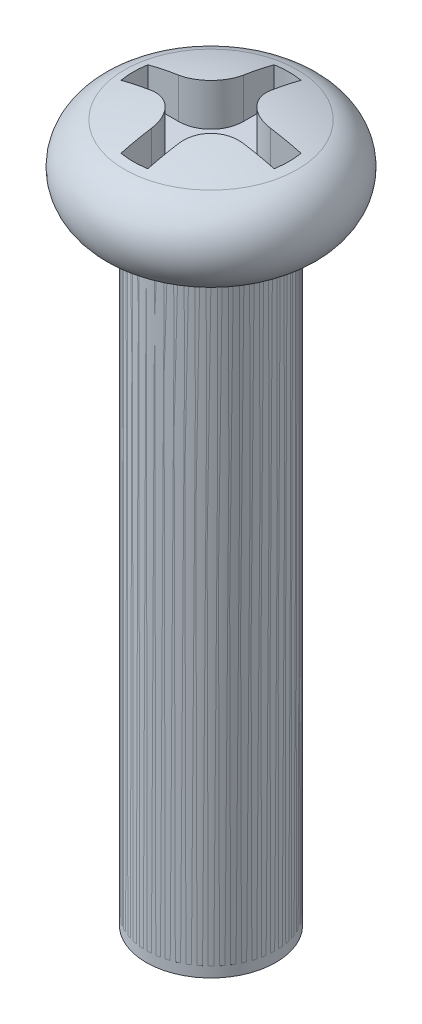
ISO-10303-21;
HEADER;
FILE_DESCRIPTION(('STEP AP214'),'2;1');
FILE_NAME('part.step','',(''),(''),'','','');
FILE_SCHEMA(('AUTOMOTIVE_DESIGN { 1 0 10303 214 1 1 1 1 }'));
ENDSEC;
DATA;
#1=APPLICATION_CONTEXT('core data for automotive mechanical design processes');
#2=APPLICATION_PROTOCOL_DEFINITION('international standard','automotive_design',2000,#1);
#3=PRODUCT_CONTEXT('',#1,'mechanical');
#4=PRODUCT('Part','Part','',(#3));
#5=PRODUCT_RELATED_PRODUCT_CATEGORY('part','',(#4));
#6=PRODUCT_DEFINITION_FORMATION('','',#4);
#7=PRODUCT_DEFINITION_CONTEXT('part definition',#1,'design');
#8=PRODUCT_DEFINITION('design','',#6,#7);
#9=PRODUCT_DEFINITION_SHAPE('','',#8);
#10=(LENGTH_UNIT() NAMED_UNIT(*) SI_UNIT(.MILLI.,.METRE.));
#11=(NAMED_UNIT(*) PLANE_ANGLE_UNIT() SI_UNIT($,.RADIAN.));
#12=(NAMED_UNIT(*) SI_UNIT($,.STERADIAN.) SOLID_ANGLE_UNIT());
#13=UNCERTAINTY_MEASURE_WITH_UNIT(LENGTH_MEASURE(1.E-05),#10,'distance_accuracy_value','');
#14=(GEOMETRIC_REPRESENTATION_CONTEXT(3) GLOBAL_UNCERTAINTY_ASSIGNED_CONTEXT((#13)) GLOBAL_UNIT_ASSIGNED_CONTEXT((#10,
#11,#12)) REPRESENTATION_CONTEXT('',''));
#15=CARTESIAN_POINT('',(0.,0.,0.));
#16=DIRECTION('',(0.,0.,1.));
#17=DIRECTION('',(1.,0.,0.));
#18=AXIS2_PLACEMENT_3D('',#15,#16,#17);
#19=CARTESIAN_POINT('',(-0.8838834764832,0.85,0.8838834764832));
#20=DIRECTION('',(0.,-1.,0.));
#21=DIRECTION('',(1.,0.,0.));
#22=AXIS2_PLACEMENT_3D('',#19,#20,#21);
#23=CYLINDRICAL_SURFACE('',#22,0.625);
#24=DIRECTION('',(0.,1.,0.));
#25=VECTOR('',#24,1.);
#26=CARTESIAN_POINT('',(-0.2588834764832,0.85,0.8838834764832));
#27=LINE('',#26,#25);
#28=CARTESIAN_POINT('',(-0.2588834764832,0.85,0.8838834764832));
#29=VERTEX_POINT('',#28);
#30=CARTESIAN_POINT('',(-0.2588834764832,1.625758041496,0.8838834764832));
#31=VERTEX_POINT('',#30);
#32=EDGE_CURVE('P0_E11',#29,#31,#27,.T.);
#33=ORIENTED_EDGE('',*,*,#32,.F.);
#34=CARTESIAN_POINT('',(-0.8838834764832,0.85,0.8838834764832));
#35=DIRECTION('',(0.,1.,0.));
#36=DIRECTION('',(1.,0.,0.));
#37=AXIS2_PLACEMENT_3D('',#34,#35,#36);
#38=CIRCLE('',#37,0.625);
#39=CARTESIAN_POINT('',(-0.8838834764832,0.85,0.2588834764832));
#40=VERTEX_POINT('',#39);
#41=EDGE_CURVE('P0_E282',#29,#40,#38,.T.);
#42=ORIENTED_EDGE('',*,*,#41,.T.);
#43=DIRECTION('',(0.,1.,0.));
#44=VECTOR('',#43,1.);
#45=CARTESIAN_POINT('',(-0.8838834764832,0.85,0.2588834764832));
#46=LINE('',#45,#44);
#47=CARTESIAN_POINT('',(-0.8838834764832,1.625758041496,0.2588834764832));
#48=VERTEX_POINT('',#47);
#49=EDGE_CURVE('P0_E275',#40,#48,#46,.T.);
#50=ORIENTED_EDGE('',*,*,#49,.T.);
#51=CARTESIAN_POINT('',(-0.2588834764832,1.625758041496,0.8838834764832));
#52=CARTESIAN_POINT('',(-0.2588834764832,1.627313817153,0.8738932385937));
#53=CARTESIAN_POINT('',(-0.2593614768553,1.63034839355,0.8539208494741));
#54=CARTESIAN_POINT('',(-0.2615225676238,1.634673278234,0.8239545492394));
#55=CARTESIAN_POINT('',(-0.2650935390821,1.63872019527,0.7943462278679));
#56=CARTESIAN_POINT('',(-0.2700536841139,1.642515148444,0.7649531756251));
#57=CARTESIAN_POINT('',(-0.2767499563293,1.646228723196,0.7343323588406));
#58=CARTESIAN_POINT('',(-0.2857599781592,1.649942886475,0.7013784870398));
#59=CARTESIAN_POINT('',(-0.2980319218456,1.65369658223,0.6648919217742));
#60=CARTESIAN_POINT('',(-0.3145124725057,1.657361744576,0.6247522681275));
#61=CARTESIAN_POINT('',(-0.3364639007454,1.660768644939,0.5807949332456));
#62=CARTESIAN_POINT('',(-0.3650765799714,1.663614857489,0.5337874817405));
#63=CARTESIAN_POINT('',(-0.4006323004899,1.665513948934,0.4859527733713));
#64=CARTESIAN_POINT('',(-0.4430484395372,1.666174855776,0.4392623764143));
#65=CARTESIAN_POINT('',(-0.4925759173438,1.66536575228,0.3949675528672));
#66=CARTESIAN_POINT('',(-0.5489382072069,1.662886586179,0.3546342400491));
#67=CARTESIAN_POINT('',(-0.6115583802421,1.658585384294,0.3198068479843));
#68=CARTESIAN_POINT('',(-0.6775697978104,1.652591342913,0.2924914538716));
#69=CARTESIAN_POINT('',(-0.7456724189469,1.645052014383,0.2730026794336));
#70=CARTESIAN_POINT('',(-0.8147416661466,1.636123692406,0.2614199025282));
#71=CARTESIAN_POINT('',(-0.8609123051646,1.629335332602,0.2588834764832));
#72=CARTESIAN_POINT('',(-0.8838834764832,1.625758041496,0.2588834764832));
#73=B_SPLINE_CURVE_WITH_KNOTS('',3,(#51,#52,#53,#54,#55,#56,#57,#58,#59,#60,#61,#62,#63,#64,#65,
#66,#67,#68,#69,#70,#71,#72),.UNSPECIFIED.,.F.,.F.,(4,1,1,1,1,1,1,1,1,1,1,1,1,1,1,1,1,1,1,4),
(0.,0.05263157894737,0.1052631578947,0.1578947368421,0.2105263157895,0.2631578947368,
0.3157894736842,0.3684210526316,0.4210526315789,0.4736842105263,0.5263157894737,0.5789473684211,
0.6315789473684,0.6842105263158,0.7368421052632,0.7894736842105,0.8421052631579,0.8947368421053,
0.9473684210526,1.),.UNSPECIFIED.);
#74=EDGE_CURVE('P0_E199',#31,#48,#73,.T.);
#75=ORIENTED_EDGE('',*,*,#74,.F.);
#76=EDGE_LOOP('',(#33,#42,#50,#75));
#77=FACE_BOUND('',#76,.T.);
#78=ADVANCED_FACE('P0_F17',(#77),#23,.T.);
#79=CARTESIAN_POINT('',(-0.2588834764832,0.85,1.477490895269));
#80=DIRECTION('',(-1.,0.,0.));
#81=DIRECTION('',(0.,0.,1.));
#82=AXIS2_PLACEMENT_3D('',#79,#80,#81);
#83=PLANE('',#82);
#84=DIRECTION('',(0.,1.,0.));
#85=VECTOR('',#84,1.);
#86=CARTESIAN_POINT('',(-0.2588834764832,0.85,1.477490895269));
#87=LINE('',#86,#85);
#88=CARTESIAN_POINT('',(-0.2588834764832,0.85,1.477490895269));
#89=VERTEX_POINT('',#88);
#90=CARTESIAN_POINT('',(-0.2588834764832,1.500900827794,1.477490895269));
#91=VERTEX_POINT('',#90);
#92=EDGE_CURVE('P0_E28',#89,#91,#87,.T.);
#93=ORIENTED_EDGE('',*,*,#92,.F.);
#94=DIRECTION('',(0.,0.,-1.));
#95=VECTOR('',#94,1.);
#96=CARTESIAN_POINT('',(-0.2588834764832,0.85,1.477490895269));
#97=LINE('',#96,#95);
#98=EDGE_CURVE('P0_E285',#89,#29,#97,.T.);
#99=ORIENTED_EDGE('',*,*,#98,.T.);
#100=ORIENTED_EDGE('',*,*,#32,.T.);
#101=CARTESIAN_POINT('',(-0.2588834764832,-4.05,0.));
#102=DIRECTION('',(-1.,0.,0.));
#103=DIRECTION('',(0.,0.9663539970004,0.2572157702812));
#104=AXIS2_PLACEMENT_3D('',#101,#102,#103);
#105=CIRCLE('',#104,5.744169160601);
#106=EDGE_CURVE('P0_E206',#91,#31,#105,.T.);
#107=ORIENTED_EDGE('',*,*,#106,.F.);
#108=EDGE_LOOP('',(#93,#99,#100,#107));
#109=FACE_BOUND('',#108,.T.);
#110=ADVANCED_FACE('P0_F351',(#109),#83,.F.);
#111=CARTESIAN_POINT('',(0.,0.85,0.));
#112=DIRECTION('',(0.,-1.,0.));
#113=DIRECTION('',(1.,0.,0.));
#114=AXIS2_PLACEMENT_3D('',#111,#112,#113);
#115=CYLINDRICAL_SURFACE('',#114,1.5);
#116=DIRECTION('',(0.,1.,0.));
#117=VECTOR('',#116,1.);
#118=CARTESIAN_POINT('',(0.2588834764832,0.85,1.477490895269));
#119=LINE('',#118,#117);
#120=CARTESIAN_POINT('',(0.2588834764832,0.85,1.477490895269));
#121=VERTEX_POINT('',#120);
#122=CARTESIAN_POINT('',(0.2588834764832,1.500900827794,1.477490895269));
#123=VERTEX_POINT('',#122);
#124=EDGE_CURVE('P0_E196',#121,#123,#119,.T.);
#125=ORIENTED_EDGE('',*,*,#124,.F.);
#126=CARTESIAN_POINT('',(0.,0.85,0.));
#127=DIRECTION('',(0.,-1.,0.));
#128=DIRECTION('',(0.172588984322101,0.,0.984993930179606));
#129=AXIS2_PLACEMENT_3D('',#126,#127,#128);
#130=CIRCLE('',#129,1.5);
#131=EDGE_CURVE('P0_E289',#121,#89,#130,.T.);
#132=ORIENTED_EDGE('',*,*,#131,.T.);
#133=ORIENTED_EDGE('',*,*,#92,.T.);
#134=CARTESIAN_POINT('',(0.,1.500900827794,0.));
#135=DIRECTION('',(0.,-1.,0.));
#136=DIRECTION('',(0.172588984322101,0.,0.984993930179606));
#137=AXIS2_PLACEMENT_3D('',#134,#135,#136);
#138=CIRCLE('',#137,1.5);
#139=EDGE_CURVE('P0_E271',#123,#91,#138,.T.);
#140=ORIENTED_EDGE('',*,*,#139,.F.);
#141=EDGE_LOOP('',(#125,#132,#133,#140));
#142=FACE_BOUND('',#141,.T.);
#143=ADVANCED_FACE('P0_F348',(#142),#115,.F.);
#144=CARTESIAN_POINT('',(0.2588834764832,0.85,0.8838834764832));
#145=DIRECTION('',(1.,0.,0.));
#146=DIRECTION('',(0.,1.,0.));
#147=AXIS2_PLACEMENT_3D('',#144,#145,#146);
#148=PLANE('',#147);
#149=DIRECTION('',(0.,1.,0.));
#150=VECTOR('',#149,1.);
#151=CARTESIAN_POINT('',(0.2588834764832,0.85,0.8838834764832));
#152=LINE('',#151,#150);
#153=CARTESIAN_POINT('',(0.2588834764832,0.85,0.8838834764832));
#154=VERTEX_POINT('',#153);
#155=CARTESIAN_POINT('',(0.2588834764832,1.625758041496,0.8838834764832));
#156=VERTEX_POINT('',#155);
#157=EDGE_CURVE('P0_E195',#154,#156,#152,.T.);
#158=ORIENTED_EDGE('',*,*,#157,.F.);
#159=DIRECTION('',(0.,0.,1.));
#160=VECTOR('',#159,1.);
#161=CARTESIAN_POINT('',(0.2588834764832,0.85,0.8838834764832));
#162=LINE('',#161,#160);
#163=EDGE_CURVE('P0_E294',#154,#121,#162,.T.);
#164=ORIENTED_EDGE('',*,*,#163,.T.);
#165=ORIENTED_EDGE('',*,*,#124,.T.);
#166=CARTESIAN_POINT('',(0.2588834764832,-4.05,0.));
#167=DIRECTION('',(1.,0.,0.));
#168=DIRECTION('',(0.,0.988090336967297,0.1538749037103));
#169=AXIS2_PLACEMENT_3D('',#166,#167,#168);
#170=CIRCLE('',#169,5.744169160601);
#171=EDGE_CURVE('P0_E215',#156,#123,#170,.T.);
#172=ORIENTED_EDGE('',*,*,#171,.F.);
#173=EDGE_LOOP('',(#158,#164,#165,#172));
#174=FACE_BOUND('',#173,.T.);
#175=ADVANCED_FACE('P0_F357',(#174),#148,.F.);
#176=CARTESIAN_POINT('',(0.8838834764832,0.85,0.8838834764832));
#177=DIRECTION('',(0.,-1.,0.));
#178=DIRECTION('',(1.,0.,0.));
#179=AXIS2_PLACEMENT_3D('',#176,#177,#178);
#180=CYLINDRICAL_SURFACE('',#179,0.625);
#181=DIRECTION('',(0.,1.,0.));
#182=VECTOR('',#181,1.);
#183=CARTESIAN_POINT('',(0.8838834764832,0.85,0.2588834764832));
#184=LINE('',#183,#182);
#185=CARTESIAN_POINT('',(0.8838834764832,0.85,0.2588834764832));
#186=VERTEX_POINT('',#185);
#187=CARTESIAN_POINT('',(0.8838834764832,1.625758041496,0.2588834764832));
#188=VERTEX_POINT('',#187);
#189=EDGE_CURVE('P0_E184',#186,#188,#184,.T.);
#190=ORIENTED_EDGE('',*,*,#189,.F.);
#191=CARTESIAN_POINT('',(0.8838834764832,0.85,0.8838834764832));
#192=DIRECTION('',(0.,1.,0.));
#193=DIRECTION('',(0.,0.,-1.));
#194=AXIS2_PLACEMENT_3D('',#191,#192,#193);
#195=CIRCLE('',#194,0.625);
#196=EDGE_CURVE('P0_E290',#186,#154,#195,.T.);
#197=ORIENTED_EDGE('',*,*,#196,.T.);
#198=ORIENTED_EDGE('',*,*,#157,.T.);
#199=CARTESIAN_POINT('',(0.8838834764832,1.625758041496,0.2588834764832));
#200=CARTESIAN_POINT('',(0.8597301232167,1.629519433313,0.2588834764832));
#201=CARTESIAN_POINT('',(0.8111778453323,1.636636006732,0.2616893322105));
#202=CARTESIAN_POINT('',(0.7386926581001,1.645905674299,0.2744825457313));
#203=CARTESIAN_POINT('',(0.6672558149784,1.653642988724,0.2960201800166));
#204=CARTESIAN_POINT('',(0.5979431944762,1.65967087888,0.3264104482816));
#205=CARTESIAN_POINT('',(0.5335866146637,1.663724976214,0.364566126247));
#206=CARTESIAN_POINT('',(0.4774020913924,1.665779073276,0.407468423887));
#207=CARTESIAN_POINT('',(0.4286335195769,1.666130665832,0.4539631112604));
#208=CARTESIAN_POINT('',(0.386908550865,1.664970386934,0.5031915333263));
#209=CARTESIAN_POINT('',(0.3536013360042,1.662638116689,0.5515763557838));
#210=CARTESIAN_POINT('',(0.3284129753595,1.65964993501,0.5960731551855));
#211=CARTESIAN_POINT('',(0.3093326553754,1.656315043534,0.6366899794746));
#212=CARTESIAN_POINT('',(0.2949538298527,1.652834733313,0.6735307970008));
#213=CARTESIAN_POINT('',(0.2840644608208,1.649304392159,0.7071909974646));
#214=CARTESIAN_POINT('',(0.2757672513997,1.645738077282,0.7384767574249));
#215=CARTESIAN_POINT('',(0.2694673555519,1.642119598834,0.7680867978621));
#216=CARTESIAN_POINT('',(0.2647385246977,1.638378053041,0.7969031354369));
#217=CARTESIAN_POINT('',(0.2613632460297,1.634414194241,0.8257799594035));
#218=CARTESIAN_POINT('',(0.2593329924708,1.630210917752,0.8548326084519));
#219=CARTESIAN_POINT('',(0.2588834764832,1.627265684621,0.8742023162184));
#220=CARTESIAN_POINT('',(0.2588834764832,1.625758041496,0.8838834764832));
#221=B_SPLINE_CURVE_WITH_KNOTS('',3,(#199,#200,#201,#202,#203,#204,#205,#206,#207,#208,#209,
#210,#211,#212,#213,#214,#215,#216,#217,#218,#219,#220),.UNSPECIFIED.,.F.,.F.,(4,1,1,1,1,1,1,1,
1,1,1,1,1,1,1,1,1,1,1,4),(0.,0.05263157894737,0.1052631578947,0.1578947368421,0.2105263157895,
0.2631578947368,0.3157894736842,0.3684210526316,0.4210526315789,0.4736842105263,0.5263157894737,
0.5789473684211,0.6315789473684,0.6842105263158,0.7368421052632,0.7894736842105,0.8421052631579,
0.8947368421053,0.9473684210526,1.),.UNSPECIFIED.);
#222=EDGE_CURVE('P0_E207',#188,#156,#221,.T.);
#223=ORIENTED_EDGE('',*,*,#222,.F.);
#224=EDGE_LOOP('',(#190,#197,#198,#223));
#225=FACE_BOUND('',#224,.T.);
#226=ADVANCED_FACE('P0_F358',(#225),#180,.T.);
#227=CARTESIAN_POINT('',(1.477490895269,0.85,0.2588834764832));
#228=DIRECTION('',(0.,0.,1.));
#229=DIRECTION('',(1.,0.,0.));
#230=AXIS2_PLACEMENT_3D('',#227,#228,#229);
#231=PLANE('',#230);
#232=DIRECTION('',(0.,1.,0.));
#233=VECTOR('',#232,1.);
#234=CARTESIAN_POINT('',(1.477490895269,0.85,0.2588834764832));
#235=LINE('',#234,#233);
#236=CARTESIAN_POINT('',(1.477490895269,0.85,0.2588834764832));
#237=VERTEX_POINT('',#236);
#238=CARTESIAN_POINT('',(1.477490895269,1.500900827794,0.2588834764832));
#239=VERTEX_POINT('',#238);
#240=EDGE_CURVE('P0_E180',#237,#239,#235,.T.);
#241=ORIENTED_EDGE('',*,*,#240,.F.);
#242=DIRECTION('',(-1.,0.,0.));
#243=VECTOR('',#242,1.);
#244=CARTESIAN_POINT('',(1.477490895269,0.85,0.2588834764832));
#245=LINE('',#244,#243);
#246=EDGE_CURVE('P0_E293',#237,#186,#245,.T.);
#247=ORIENTED_EDGE('',*,*,#246,.T.);
#248=ORIENTED_EDGE('',*,*,#189,.T.);
#249=CARTESIAN_POINT('',(0.,-4.05,0.2588834764832));
#250=DIRECTION('',(0.,0.,1.));
#251=DIRECTION('',(0.2572157702812,0.9663539970004,0.));
#252=AXIS2_PLACEMENT_3D('',#249,#250,#251);
#253=CIRCLE('',#252,5.744169160601);
#254=EDGE_CURVE('P0_E216',#239,#188,#253,.T.);
#255=ORIENTED_EDGE('',*,*,#254,.F.);
#256=EDGE_LOOP('',(#241,#247,#248,#255));
#257=FACE_BOUND('',#256,.T.);
#258=ADVANCED_FACE('P0_F362',(#257),#231,.F.);
#259=CARTESIAN_POINT('',(0.,0.85,0.));
#260=DIRECTION('',(0.,-1.,0.));
#261=DIRECTION('',(1.,0.,0.));
#262=AXIS2_PLACEMENT_3D('',#259,#260,#261);
#263=CYLINDRICAL_SURFACE('',#262,1.5);
#264=CARTESIAN_POINT('',(0.,1.500900827794,0.));
#265=DIRECTION('',(0.,-1.,0.));
#266=DIRECTION('',(0.984993930179606,0.,-0.172588984322101));
#267=AXIS2_PLACEMENT_3D('',#264,#265,#266);
#268=CIRCLE('',#267,1.5);
#269=CARTESIAN_POINT('',(1.477490895269,1.500900827794,-0.2588834764832));
#270=VERTEX_POINT('',#269);
#271=EDGE_CURVE('P0_E236',#270,#239,#268,.T.);
#272=ORIENTED_EDGE('',*,*,#271,.F.);
#273=DIRECTION('',(0.,1.,0.));
#274=VECTOR('',#273,1.);
#275=CARTESIAN_POINT('',(1.477490895269,0.85,-0.2588834764832));
#276=LINE('',#275,#274);
#277=CARTESIAN_POINT('',(1.477490895269,0.85,-0.2588834764832));
#278=VERTEX_POINT('',#277);
#279=EDGE_CURVE('P0_E185',#278,#270,#276,.T.);
#280=ORIENTED_EDGE('',*,*,#279,.F.);
#281=CARTESIAN_POINT('',(0.,0.85,0.));
#282=DIRECTION('',(0.,-1.,0.));
#283=DIRECTION('',(0.984993930179606,0.,-0.172588984322101));
#284=AXIS2_PLACEMENT_3D('',#281,#282,#283);
#285=CIRCLE('',#284,1.5);
#286=EDGE_CURVE('P0_E301',#278,#237,#285,.T.);
#287=ORIENTED_EDGE('',*,*,#286,.T.);
#288=ORIENTED_EDGE('',*,*,#240,.T.);
#289=EDGE_LOOP('',(#272,#280,#287,#288));
#290=FACE_BOUND('',#289,.T.);
#291=ADVANCED_FACE('P0_F446',(#290),#263,.F.);
#292=CARTESIAN_POINT('',(0.8838834764832,0.85,-0.2588834764832));
#293=DIRECTION('',(0.,0.,-1.));
#294=DIRECTION('',(0.,-1.,0.));
#295=AXIS2_PLACEMENT_3D('',#292,#293,#294);
#296=PLANE('',#295);
#297=DIRECTION('',(0.,1.,0.));
#298=VECTOR('',#297,1.);
#299=CARTESIAN_POINT('',(0.8838834764832,0.85,-0.2588834764832));
#300=LINE('',#299,#298);
#301=CARTESIAN_POINT('',(0.8838834764832,0.85,-0.2588834764832));
#302=VERTEX_POINT('',#301);
#303=CARTESIAN_POINT('',(0.8838834764832,1.625758041496,-0.2588834764832));
#304=VERTEX_POINT('',#303);
#305=EDGE_CURVE('P0_E192',#302,#304,#300,.T.);
#306=ORIENTED_EDGE('',*,*,#305,.F.);
#307=DIRECTION('',(1.,0.,0.));
#308=VECTOR('',#307,1.);
#309=CARTESIAN_POINT('',(0.8838834764832,0.85,-0.2588834764832));
#310=LINE('',#309,#308);
#311=EDGE_CURVE('P0_E171',#302,#278,#310,.T.);
#312=ORIENTED_EDGE('',*,*,#311,.T.);
#313=ORIENTED_EDGE('',*,*,#279,.T.);
#314=CARTESIAN_POINT('',(0.,-4.05,-0.2588834764832));
#315=DIRECTION('',(0.,0.,-1.));
#316=DIRECTION('',(0.1538749037103,0.988090336967297,0.));
#317=AXIS2_PLACEMENT_3D('',#314,#315,#316);
#318=CIRCLE('',#317,5.744169160601);
#319=EDGE_CURVE('P0_E225',#304,#270,#318,.T.);
#320=ORIENTED_EDGE('',*,*,#319,.F.);
#321=EDGE_LOOP('',(#306,#312,#313,#320));
#322=FACE_BOUND('',#321,.T.);
#323=ADVANCED_FACE('P0_F454',(#322),#296,.F.);
#324=CARTESIAN_POINT('',(0.8838834764832,0.85,-0.8838834764832));
#325=DIRECTION('',(0.,-1.,0.));
#326=DIRECTION('',(1.,0.,0.));
#327=AXIS2_PLACEMENT_3D('',#324,#325,#326);
#328=CYLINDRICAL_SURFACE('',#327,0.625);
#329=DIRECTION('',(0.,1.,0.));
#330=VECTOR('',#329,1.);
#331=CARTESIAN_POINT('',(0.2588834764832,0.85,-0.8838834764832));
#332=LINE('',#331,#330);
#333=CARTESIAN_POINT('',(0.2588834764832,0.85,-0.8838834764832));
#334=VERTEX_POINT('',#333);
#335=CARTESIAN_POINT('',(0.2588834764832,1.625758041496,-0.8838834764832));
#336=VERTEX_POINT('',#335);
#337=EDGE_CURVE('P0_E148',#334,#336,#332,.T.);
#338=ORIENTED_EDGE('',*,*,#337,.F.);
#339=CARTESIAN_POINT('',(0.8838834764832,0.85,-0.8838834764832));
#340=DIRECTION('',(0.,1.,0.));
#341=DIRECTION('',(-1.,0.,0.));
#342=AXIS2_PLACEMENT_3D('',#339,#340,#341);
#343=CIRCLE('',#342,0.625);
#344=EDGE_CURVE('P0_E164',#334,#302,#343,.T.);
#345=ORIENTED_EDGE('',*,*,#344,.T.);
#346=ORIENTED_EDGE('',*,*,#305,.T.);
#347=CARTESIAN_POINT('',(0.2588834764832,1.625758041496,-0.8838834764832));
#348=CARTESIAN_POINT('',(0.2588834764832,1.627313817153,-0.8738932385937));
#349=CARTESIAN_POINT('',(0.2593614768553,1.63034839355,-0.8539208494741));
#350=CARTESIAN_POINT('',(0.2615225676238,1.634673278234,-0.8239545492394));
#351=CARTESIAN_POINT('',(0.2650935390821,1.63872019527,-0.7943462278679));
#352=CARTESIAN_POINT('',(0.2700536841139,1.642515148444,-0.7649531756251));
#353=CARTESIAN_POINT('',(0.2767499563293,1.646228723196,-0.7343323588406));
#354=CARTESIAN_POINT('',(0.2857599781592,1.649942886475,-0.7013784870398));
#355=CARTESIAN_POINT('',(0.2980319218456,1.65369658223,-0.6648919217742));
#356=CARTESIAN_POINT('',(0.3145124725057,1.657361744576,-0.6247522681275));
#357=CARTESIAN_POINT('',(0.3364639007454,1.660768644939,-0.5807949332456));
#358=CARTESIAN_POINT('',(0.3650765799714,1.663614857489,-0.5337874817405));
#359=CARTESIAN_POINT('',(0.4006323004899,1.665513948934,-0.4859527733713));
#360=CARTESIAN_POINT('',(0.4430484395372,1.666174855776,-0.4392623764143));
#361=CARTESIAN_POINT('',(0.4925759173438,1.66536575228,-0.3949675528672));
#362=CARTESIAN_POINT('',(0.5489382072069,1.662886586179,-0.3546342400491));
#363=CARTESIAN_POINT('',(0.6115583802421,1.658585384294,-0.3198068479843));
#364=CARTESIAN_POINT('',(0.6775697978104,1.652591342913,-0.2924914538716));
#365=CARTESIAN_POINT('',(0.7456724189469,1.645052014383,-0.2730026794336));
#366=CARTESIAN_POINT('',(0.8147416661466,1.636123692406,-0.2614199025282));
#367=CARTESIAN_POINT('',(0.8609123051646,1.629335332602,-0.2588834764832));
#368=CARTESIAN_POINT('',(0.8838834764832,1.625758041496,-0.2588834764832));
#369=B_SPLINE_CURVE_WITH_KNOTS('',3,(#347,#348,#349,#350,#351,#352,#353,#354,#355,#356,#357,
#358,#359,#360,#361,#362,#363,#364,#365,#366,#367,#368),.UNSPECIFIED.,.F.,.F.,(4,1,1,1,1,1,1,1,
1,1,1,1,1,1,1,1,1,1,1,4),(0.,0.05263157894737,0.1052631578947,0.1578947368421,0.2105263157895,
0.2631578947368,0.3157894736842,0.3684210526316,0.4210526315789,0.4736842105263,0.5263157894737,
0.5789473684211,0.6315789473684,0.6842105263158,0.7368421052632,0.7894736842105,0.8421052631579,
0.8947368421053,0.9473684210526,1.),.UNSPECIFIED.);
#370=EDGE_CURVE('P0_E217',#336,#304,#369,.T.);
#371=ORIENTED_EDGE('',*,*,#370,.F.);
#372=EDGE_LOOP('',(#338,#345,#346,#371));
#373=FACE_BOUND('',#372,.T.);
#374=ADVANCED_FACE('P0_F463',(#373),#328,.T.);
#375=CARTESIAN_POINT('',(0.2588834764832,0.85,-1.477490895269));
#376=DIRECTION('',(1.,0.,0.));
#377=DIRECTION('',(0.,1.,0.));
#378=AXIS2_PLACEMENT_3D('',#375,#376,#377);
#379=PLANE('',#378);
#380=DIRECTION('',(0.,1.,0.));
#381=VECTOR('',#380,1.);
#382=CARTESIAN_POINT('',(0.2588834764832,0.85,-1.477490895269));
#383=LINE('',#382,#381);
#384=CARTESIAN_POINT('',(0.2588834764832,0.85,-1.477490895269));
#385=VERTEX_POINT('',#384);
#386=CARTESIAN_POINT('',(0.2588834764832,1.500900827794,-1.477490895269));
#387=VERTEX_POINT('',#386);
#388=EDGE_CURVE('P0_E134',#385,#387,#383,.T.);
#389=ORIENTED_EDGE('',*,*,#388,.F.);
#390=DIRECTION('',(0.,0.,1.));
#391=VECTOR('',#390,1.);
#392=CARTESIAN_POINT('',(0.2588834764832,0.85,-1.477490895269));
#393=LINE('',#392,#391);
#394=EDGE_CURVE('P0_E139',#385,#334,#393,.T.);
#395=ORIENTED_EDGE('',*,*,#394,.T.);
#396=ORIENTED_EDGE('',*,*,#337,.T.);
#397=CARTESIAN_POINT('',(0.2588834764832,-4.05,0.));
#398=DIRECTION('',(1.,0.,0.));
#399=DIRECTION('',(0.,0.9663539970004,-0.2572157702812));
#400=AXIS2_PLACEMENT_3D('',#397,#398,#399);
#401=CIRCLE('',#400,5.744169160601);
#402=EDGE_CURVE('P0_E143',#387,#336,#401,.T.);
#403=ORIENTED_EDGE('',*,*,#402,.F.);
#404=EDGE_LOOP('',(#389,#395,#396,#403));
#405=FACE_BOUND('',#404,.T.);
#406=ADVANCED_FACE('P0_F136',(#405),#379,.F.);
#407=CARTESIAN_POINT('',(0.,0.85,0.));
#408=DIRECTION('',(0.,-1.,0.));
#409=DIRECTION('',(1.,0.,0.));
#410=AXIS2_PLACEMENT_3D('',#407,#408,#409);
#411=CYLINDRICAL_SURFACE('',#410,1.5);
#412=DIRECTION('',(0.,1.,0.));
#413=VECTOR('',#412,1.);
#414=CARTESIAN_POINT('',(-0.2588834764832,0.85,-1.477490895269));
#415=LINE('',#414,#413);
#416=CARTESIAN_POINT('',(-0.2588834764832,0.85,-1.477490895269));
#417=VERTEX_POINT('',#416);
#418=CARTESIAN_POINT('',(-0.2588834764832,1.500900827794,-1.477490895269));
#419=VERTEX_POINT('',#418);
#420=EDGE_CURVE('P0_E149',#417,#419,#415,.T.);
#421=ORIENTED_EDGE('',*,*,#420,.F.);
#422=CARTESIAN_POINT('',(0.,0.85,0.));
#423=DIRECTION('',(0.,-1.,0.));
#424=DIRECTION('',(-0.172588984322101,0.,-0.984993930179606));
#425=AXIS2_PLACEMENT_3D('',#422,#423,#424);
#426=CIRCLE('',#425,1.5);
#427=EDGE_CURVE('P0_E152',#417,#385,#426,.T.);
#428=ORIENTED_EDGE('',*,*,#427,.T.);
#429=ORIENTED_EDGE('',*,*,#388,.T.);
#430=CARTESIAN_POINT('',(0.,1.500900827794,0.));
#431=DIRECTION('',(0.,-1.,0.));
#432=DIRECTION('',(-0.172588984322101,0.,-0.984993930179606));
#433=AXIS2_PLACEMENT_3D('',#430,#431,#432);
#434=CIRCLE('',#433,1.5);
#435=EDGE_CURVE('P0_E238',#419,#387,#434,.T.);
#436=ORIENTED_EDGE('',*,*,#435,.F.);
#437=EDGE_LOOP('',(#421,#428,#429,#436));
#438=FACE_BOUND('',#437,.T.);
#439=ADVANCED_FACE('P0_F153',(#438),#411,.F.);
#440=CARTESIAN_POINT('',(-0.2588834764832,0.85,-0.8838834764832));
#441=DIRECTION('',(-1.,0.,0.));
#442=DIRECTION('',(0.,0.,1.));
#443=AXIS2_PLACEMENT_3D('',#440,#441,#442);
#444=PLANE('',#443);
#445=DIRECTION('',(0.,1.,0.));
#446=VECTOR('',#445,1.);
#447=CARTESIAN_POINT('',(-0.2588834764832,0.85,-0.8838834764832));
#448=LINE('',#447,#446);
#449=CARTESIAN_POINT('',(-0.2588834764832,0.85,-0.8838834764832));
#450=VERTEX_POINT('',#449);
#451=CARTESIAN_POINT('',(-0.2588834764832,1.625758041496,-0.8838834764832));
#452=VERTEX_POINT('',#451);
#453=EDGE_CURVE('P0_E54',#450,#452,#448,.T.);
#454=ORIENTED_EDGE('',*,*,#453,.F.);
#455=DIRECTION('',(0.,0.,-1.));
#456=VECTOR('',#455,1.);
#457=CARTESIAN_POINT('',(-0.2588834764832,0.85,-0.8838834764832));
#458=LINE('',#457,#456);
#459=EDGE_CURVE('P0_E158',#450,#417,#458,.T.);
#460=ORIENTED_EDGE('',*,*,#459,.T.);
#461=ORIENTED_EDGE('',*,*,#420,.T.);
#462=CARTESIAN_POINT('',(-0.2588834764832,-4.05,0.));
#463=DIRECTION('',(-1.,0.,0.));
#464=DIRECTION('',(0.,0.988090336967297,-0.1538749037103));
#465=AXIS2_PLACEMENT_3D('',#462,#463,#464);
#466=CIRCLE('',#465,5.744169160601);
#467=EDGE_CURVE('P0_E244',#452,#419,#466,.T.);
#468=ORIENTED_EDGE('',*,*,#467,.F.);
#469=EDGE_LOOP('',(#454,#460,#461,#468));
#470=FACE_BOUND('',#469,.T.);
#471=ADVANCED_FACE('P0_F483',(#470),#444,.F.);
#472=CARTESIAN_POINT('',(-0.8838834764832,0.85,-0.8838834764832));
#473=DIRECTION('',(0.,-1.,0.));
#474=DIRECTION('',(1.,0.,0.));
#475=AXIS2_PLACEMENT_3D('',#472,#473,#474);
#476=CYLINDRICAL_SURFACE('',#475,0.625);
#477=DIRECTION('',(0.,1.,0.));
#478=VECTOR('',#477,1.);
#479=CARTESIAN_POINT('',(-0.8838834764832,0.85,-0.2588834764832));
#480=LINE('',#479,#478);
#481=CARTESIAN_POINT('',(-0.8838834764832,0.85,-0.2588834764832));
#482=VERTEX_POINT('',#481);
#483=CARTESIAN_POINT('',(-0.8838834764832,1.625758041496,-0.2588834764832));
#484=VERTEX_POINT('',#483);
#485=EDGE_CURVE('P0_E41',#482,#484,#480,.T.);
#486=ORIENTED_EDGE('',*,*,#485,.F.);
#487=CARTESIAN_POINT('',(-0.8838834764832,0.85,-0.8838834764832));
#488=DIRECTION('',(0.,1.,0.));
#489=DIRECTION('',(0.,0.,1.));
#490=AXIS2_PLACEMENT_3D('',#487,#488,#489);
#491=CIRCLE('',#490,0.625);
#492=EDGE_CURVE('P0_E175',#482,#450,#491,.T.);
#493=ORIENTED_EDGE('',*,*,#492,.T.);
#494=ORIENTED_EDGE('',*,*,#453,.T.);
#495=CARTESIAN_POINT('',(-0.8838834764832,1.625758041496,-0.2588834764832));
#496=CARTESIAN_POINT('',(-0.8597301232166,1.629519433313,-0.2588834764832));
#497=CARTESIAN_POINT('',(-0.8111778453323,1.636636006732,-0.2616893322105));
#498=CARTESIAN_POINT('',(-0.7386926581001,1.645905674299,-0.2744825457313));
#499=CARTESIAN_POINT('',(-0.6672558149784,1.653642988724,-0.2960201800166));
#500=CARTESIAN_POINT('',(-0.5979431944762,1.65967087888,-0.3264104482816));
#501=CARTESIAN_POINT('',(-0.5335866146637,1.663724976214,-0.364566126247));
#502=CARTESIAN_POINT('',(-0.4774020913924,1.665779073276,-0.407468423887));
#503=CARTESIAN_POINT('',(-0.4286335195769,1.666130665832,-0.4539631112605));
#504=CARTESIAN_POINT('',(-0.386908550865,1.664970386934,-0.5031915333263));
#505=CARTESIAN_POINT('',(-0.3536013360042,1.662638116689,-0.5515763557838));
#506=CARTESIAN_POINT('',(-0.3284129753595,1.65964993501,-0.5960731551855));
#507=CARTESIAN_POINT('',(-0.3093326553754,1.656315043534,-0.6366899794746));
#508=CARTESIAN_POINT('',(-0.2949538298527,1.652834733313,-0.6735307970008));
#509=CARTESIAN_POINT('',(-0.2840644608208,1.649304392159,-0.7071909974646));
#510=CARTESIAN_POINT('',(-0.2757672513997,1.645738077282,-0.7384767574249));
#511=CARTESIAN_POINT('',(-0.2694673555519,1.642119598834,-0.7680867978621));
#512=CARTESIAN_POINT('',(-0.2647385246977,1.638378053041,-0.7969031354369));
#513=CARTESIAN_POINT('',(-0.2613632460297,1.634414194241,-0.8257799594036));
#514=CARTESIAN_POINT('',(-0.2593329924708,1.630210917752,-0.8548326084519));
#515=CARTESIAN_POINT('',(-0.2588834764832,1.627265684621,-0.8742023162184));
#516=CARTESIAN_POINT('',(-0.2588834764832,1.625758041496,-0.8838834764832));
#517=B_SPLINE_CURVE_WITH_KNOTS('',3,(#495,#496,#497,#498,#499,#500,#501,#502,#503,#504,#505,
#506,#507,#508,#509,#510,#511,#512,#513,#514,#515,#516),.UNSPECIFIED.,.F.,.F.,(4,1,1,1,1,1,1,1,
1,1,1,1,1,1,1,1,1,1,1,4),(0.,0.05263157894737,0.1052631578947,0.1578947368421,0.2105263157895,
0.2631578947368,0.3157894736842,0.3684210526316,0.4210526315789,0.4736842105263,0.5263157894737,
0.5789473684211,0.6315789473684,0.6842105263158,0.7368421052632,0.7894736842105,0.8421052631579,
0.8947368421053,0.9473684210526,1.),.UNSPECIFIED.);
#518=EDGE_CURVE('P0_E20',#484,#452,#517,.T.);
#519=ORIENTED_EDGE('',*,*,#518,.F.);
#520=EDGE_LOOP('',(#486,#493,#494,#519));
#521=FACE_BOUND('',#520,.T.);
#522=ADVANCED_FACE('P0_F477',(#521),#476,.T.);
#523=CARTESIAN_POINT('',(-1.477490895269,0.85,-0.2588834764832));
#524=DIRECTION('',(0.,0.,-1.));
#525=DIRECTION('',(0.,-1.,0.));
#526=AXIS2_PLACEMENT_3D('',#523,#524,#525);
#527=PLANE('',#526);
#528=DIRECTION('',(0.,1.,0.));
#529=VECTOR('',#528,1.);
#530=CARTESIAN_POINT('',(-1.477490895269,0.85,-0.2588834764832));
#531=LINE('',#530,#529);
#532=CARTESIAN_POINT('',(-1.477490895269,0.85,-0.2588834764832));
#533=VERTEX_POINT('',#532);
#534=CARTESIAN_POINT('',(-1.477490895269,1.500900827794,-0.2588834764832));
#535=VERTEX_POINT('',#534);
#536=EDGE_CURVE('P0_E262',#533,#535,#531,.T.);
#537=ORIENTED_EDGE('',*,*,#536,.F.);
#538=DIRECTION('',(1.,0.,0.));
#539=VECTOR('',#538,1.);
#540=CARTESIAN_POINT('',(-1.477490895269,0.85,-0.2588834764832));
#541=LINE('',#540,#539);
#542=EDGE_CURVE('P0_E177',#533,#482,#541,.T.);
#543=ORIENTED_EDGE('',*,*,#542,.T.);
#544=ORIENTED_EDGE('',*,*,#485,.T.);
#545=CARTESIAN_POINT('',(0.,-4.05,-0.2588834764832));
#546=DIRECTION('',(0.,0.,-1.));
#547=DIRECTION('',(-0.2572157702812,0.9663539970004,0.));
#548=AXIS2_PLACEMENT_3D('',#545,#546,#547);
#549=CIRCLE('',#548,5.744169160601);
#550=EDGE_CURVE('P0_E336',#535,#484,#549,.T.);
#551=ORIENTED_EDGE('',*,*,#550,.F.);
#552=EDGE_LOOP('',(#537,#543,#544,#551));
#553=FACE_BOUND('',#552,.T.);
#554=ADVANCED_FACE('P0_F482',(#553),#527,.F.);
#555=CARTESIAN_POINT('',(0.,0.85,0.));
#556=DIRECTION('',(0.,-1.,0.));
#557=DIRECTION('',(0.,0.,-1.));
#558=AXIS2_PLACEMENT_3D('',#555,#556,#557);
#559=PLANE('',#558);
#560=ORIENTED_EDGE('',*,*,#41,.F.);
#561=ORIENTED_EDGE('',*,*,#98,.F.);
#562=ORIENTED_EDGE('',*,*,#131,.F.);
#563=ORIENTED_EDGE('',*,*,#163,.F.);
#564=ORIENTED_EDGE('',*,*,#196,.F.);
#565=ORIENTED_EDGE('',*,*,#246,.F.);
#566=ORIENTED_EDGE('',*,*,#286,.F.);
#567=ORIENTED_EDGE('',*,*,#311,.F.);
#568=ORIENTED_EDGE('',*,*,#344,.F.);
#569=ORIENTED_EDGE('',*,*,#394,.F.);
#570=ORIENTED_EDGE('',*,*,#427,.F.);
#571=ORIENTED_EDGE('',*,*,#459,.F.);
#572=ORIENTED_EDGE('',*,*,#492,.F.);
#573=ORIENTED_EDGE('',*,*,#542,.F.);
#574=CARTESIAN_POINT('',(0.,0.85,0.));
#575=DIRECTION('',(0.,-1.,0.));
#576=DIRECTION('',(-0.984993930179606,0.,0.172588984322101));
#577=AXIS2_PLACEMENT_3D('',#574,#575,#576);
#578=CIRCLE('',#577,1.5);
#579=CARTESIAN_POINT('',(-1.477490895269,0.85,0.2588834764832));
#580=VERTEX_POINT('',#579);
#581=EDGE_CURVE('P0_E257',#580,#533,#578,.T.);
#582=ORIENTED_EDGE('',*,*,#581,.F.);
#583=DIRECTION('',(-1.,0.,0.));
#584=VECTOR('',#583,1.);
#585=CARTESIAN_POINT('',(-0.8838834764832,0.85,0.2588834764832));
#586=LINE('',#585,#584);
#587=EDGE_CURVE('P0_E278',#40,#580,#586,.T.);
#588=ORIENTED_EDGE('',*,*,#587,.F.);
#589=EDGE_LOOP('',(#560,#561,#562,#563,#564,#565,#566,#567,#568,#569,#570,#571,#572,#573,#582,#588));
#590=FACE_BOUND('',#589,.T.);
#591=ADVANCED_FACE('P0_F161',(#590),#559,.F.);
#592=CARTESIAN_POINT('',(-0.8838834764832,0.85,0.2588834764832));
#593=DIRECTION('',(0.,0.,1.));
#594=DIRECTION('',(1.,0.,0.));
#595=AXIS2_PLACEMENT_3D('',#592,#593,#594);
#596=PLANE('',#595);
#597=ORIENTED_EDGE('',*,*,#49,.F.);
#598=ORIENTED_EDGE('',*,*,#587,.T.);
#599=DIRECTION('',(0.,1.,0.));
#600=VECTOR('',#599,1.);
#601=CARTESIAN_POINT('',(-1.477490895269,0.85,0.2588834764832));
#602=LINE('',#601,#600);
#603=CARTESIAN_POINT('',(-1.477490895269,1.500900827794,0.2588834764832));
#604=VERTEX_POINT('',#603);
#605=EDGE_CURVE('P0_E254',#580,#604,#602,.T.);
#606=ORIENTED_EDGE('',*,*,#605,.T.);
#607=CARTESIAN_POINT('',(0.,-4.05,0.2588834764832));
#608=DIRECTION('',(0.,0.,1.));
#609=DIRECTION('',(-0.1538749037103,0.988090336967297,0.));
#610=AXIS2_PLACEMENT_3D('',#607,#608,#609);
#611=CIRCLE('',#610,5.744169160601);
#612=EDGE_CURVE('P0_E205',#48,#604,#611,.T.);
#613=ORIENTED_EDGE('',*,*,#612,.F.);
#614=EDGE_LOOP('',(#597,#598,#606,#613));
#615=FACE_BOUND('',#614,.T.);
#616=ADVANCED_FACE('P0_F381',(#615),#596,.F.);
#617=CARTESIAN_POINT('',(0.,0.85,0.));
#618=DIRECTION('',(0.,-1.,0.));
#619=DIRECTION('',(1.,0.,0.));
#620=AXIS2_PLACEMENT_3D('',#617,#618,#619);
#621=CYLINDRICAL_SURFACE('',#620,1.5);
#622=ORIENTED_EDGE('',*,*,#605,.F.);
#623=ORIENTED_EDGE('',*,*,#581,.T.);
#624=ORIENTED_EDGE('',*,*,#536,.T.);
#625=CARTESIAN_POINT('',(0.,1.500900827794,0.));
#626=DIRECTION('',(0.,-1.,0.));
#627=DIRECTION('',(-1.,0.,0.));
#628=AXIS2_PLACEMENT_3D('',#625,#626,#627);
#629=CIRCLE('',#628,1.5);
#630=EDGE_CURVE('P0_E249',#604,#535,#629,.T.);
#631=ORIENTED_EDGE('',*,*,#630,.F.);
#632=EDGE_LOOP('',(#622,#623,#624,#631));
#633=FACE_BOUND('',#632,.T.);
#634=ADVANCED_FACE('P0_F383',(#633),#621,.F.);
#635=CARTESIAN_POINT('',(0.,-4.05,0.));
#636=DIRECTION('',(0.,-1.,0.));
#637=DIRECTION('',(-1.,0.,0.));
#638=AXIS2_PLACEMENT_3D('',#635,#636,#637);
#639=SPHERICAL_SURFACE('',#638,5.75);
#640=ORIENTED_EDGE('',*,*,#271,.T.);
#641=ORIENTED_EDGE('',*,*,#254,.T.);
#642=ORIENTED_EDGE('',*,*,#222,.T.);
#643=ORIENTED_EDGE('',*,*,#171,.T.);
#644=ORIENTED_EDGE('',*,*,#139,.T.);
#645=ORIENTED_EDGE('',*,*,#106,.T.);
#646=ORIENTED_EDGE('',*,*,#74,.T.);
#647=ORIENTED_EDGE('',*,*,#612,.T.);
#648=ORIENTED_EDGE('',*,*,#630,.T.);
#649=ORIENTED_EDGE('',*,*,#550,.T.);
#650=ORIENTED_EDGE('',*,*,#518,.T.);
#651=ORIENTED_EDGE('',*,*,#467,.T.);
#652=ORIENTED_EDGE('',*,*,#435,.T.);
#653=ORIENTED_EDGE('',*,*,#402,.T.);
#654=ORIENTED_EDGE('',*,*,#370,.T.);
#655=ORIENTED_EDGE('',*,*,#319,.T.);
#656=EDGE_LOOP('',(#640,#641,#642,#643,#644,#645,#646,#647,#648,#649,#650,#651,#652,#653,#654,#655));
#657=FACE_BOUND('',#656,.T.);
#658=CARTESIAN_POINT('',(0.,1.453155660366,0.));
#659=DIRECTION('',(0.,-1.,0.));
#660=DIRECTION('',(1.,0.,0.));
#661=AXIS2_PLACEMENT_3D('',#658,#659,#660);
#662=CIRCLE('',#661,1.666666666667);
#663=CARTESIAN_POINT('',(1.666666666667,1.453155660366,0.));
#664=VERTEX_POINT('',#663);
#665=EDGE_CURVE('P0_E327',#664,#664,#662,.T.);
#666=ORIENTED_EDGE('',*,*,#665,.F.);
#667=EDGE_LOOP('',(#666));
#668=FACE_BOUND('',#667,.T.);
#669=ADVANCED_FACE('P0_F353',(#657,#668),#639,.T.);
#670=CARTESIAN_POINT('',(0.,0.6669905660283,0.));
#671=DIRECTION('',(0.,-1.,0.));
#672=DIRECTION('',(-1.,0.,0.));
#673=AXIS2_PLACEMENT_3D('',#670,#671,#672);
#674=TOROIDAL_SURFACE('',#673,1.428571428571,0.8214285714286);
#675=ORIENTED_EDGE('',*,*,#665,.T.);
#676=EDGE_LOOP('',(#675));
#677=FACE_BOUND('',#676,.T.);
#678=CARTESIAN_POINT('',(0.,0.,0.));
#679=DIRECTION('',(0.,1.,0.));
#680=DIRECTION('',(1.,0.,0.));
#681=AXIS2_PLACEMENT_3D('',#678,#679,#680);
#682=CIRCLE('',#681,1.908017445124);
#683=CARTESIAN_POINT('',(1.908017445124,0.,0.));
#684=VERTEX_POINT('',#683);
#685=EDGE_CURVE('P0_E323',#684,#684,#682,.T.);
#686=ORIENTED_EDGE('',*,*,#685,.T.);
#687=EDGE_LOOP('',(#686));
#688=FACE_BOUND('',#687,.T.);
#689=ADVANCED_FACE('P0_F528',(#677,#688),#674,.T.);
#690=CARTESIAN_POINT('',(0.,0.,0.));
#691=DIRECTION('',(0.,-1.,0.));
#692=DIRECTION('',(0.,0.,-1.));
#693=AXIS2_PLACEMENT_3D('',#690,#691,#692);
#694=PLANE('',#693);
#695=CARTESIAN_POINT('',(0.,0.,0.));
#696=DIRECTION('',(0.,-1.,0.));
#697=DIRECTION('',(1.,0.,0.));
#698=AXIS2_PLACEMENT_3D('',#695,#696,#697);
#699=CIRCLE('',#698,1.25);
#700=CARTESIAN_POINT('',(1.25,0.,0.));
#701=VERTEX_POINT('',#700);
#702=EDGE_CURVE('P0_E316',#701,#701,#699,.T.);
#703=ORIENTED_EDGE('',*,*,#702,.F.);
#704=EDGE_LOOP('',(#703));
#705=FACE_BOUND('',#704,.T.);
#706=ORIENTED_EDGE('',*,*,#685,.F.);
#707=EDGE_LOOP('',(#706));
#708=FACE_BOUND('',#707,.T.);
#709=ADVANCED_FACE('P0_F536',(#705,#708),#694,.T.);
#710=CARTESIAN_POINT('',(0.,2.385,0.));
#711=DIRECTION('',(0.,-1.,0.));
#712=DIRECTION('',(-1.,0.,0.));
#713=AXIS2_PLACEMENT_3D('',#710,#711,#712);
#714=CYLINDRICAL_SURFACE('',#713,1.25);
#715=ORIENTED_EDGE('',*,*,#702,.T.);
#716=EDGE_LOOP('',(#715));
#717=FACE_BOUND('',#716,.T.);
#718=CARTESIAN_POINT('',(0.,-11.8,0.));
#719=DIRECTION('',(0.,-1.,0.));
#720=DIRECTION('',(-1.,0.,0.));
#721=AXIS2_PLACEMENT_3D('',#718,#719,#720);
#722=CIRCLE('',#721,1.25);
#723=CARTESIAN_POINT('',(-1.25,-11.8,0.));
#724=VERTEX_POINT('',#723);
#725=EDGE_CURVE('P0_E647',#724,#724,#722,.T.);
#726=ORIENTED_EDGE('',*,*,#725,.F.);
#727=EDGE_LOOP('',(#726));
#728=FACE_BOUND('',#727,.T.);
#729=ADVANCED_FACE('P0_F546',(#717,#728),#714,.T.);
#730=CARTESIAN_POINT('',(0.,-11.9,0.));
#731=DIRECTION('',(0.,1.,0.));
#732=DIRECTION('',(1.,0.,0.));
#733=AXIS2_PLACEMENT_3D('',#730,#731,#732);
#734=CONICAL_SURFACE('',#733,1.15,0.7853981633973);
#735=CARTESIAN_POINT('',(0.,-12.,0.));
#736=DIRECTION('',(0.,1.,0.));
#737=DIRECTION('',(-1.,0.,0.));
#738=AXIS2_PLACEMENT_3D('',#735,#736,#737);
#739=CIRCLE('',#738,1.05);
#740=CARTESIAN_POINT('',(-1.05,-12.,0.));
#741=VERTEX_POINT('',#740);
#742=EDGE_CURVE('P0_E645',#741,#741,#739,.T.);
#743=ORIENTED_EDGE('',*,*,#742,.T.);
#744=EDGE_LOOP('',(#743));
#745=FACE_BOUND('',#744,.T.);
#746=ORIENTED_EDGE('',*,*,#725,.T.);
#747=EDGE_LOOP('',(#746));
#748=FACE_BOUND('',#747,.T.);
#749=ADVANCED_FACE('P0_F561',(#745,#748),#734,.T.);
#750=CARTESIAN_POINT('',(0.,-12.,0.));
#751=DIRECTION('',(0.,-1.,0.));
#752=DIRECTION('',(0.,0.,-1.));
#753=AXIS2_PLACEMENT_3D('',#750,#751,#752);
#754=PLANE('',#753);
#755=ORIENTED_EDGE('',*,*,#742,.F.);
#756=EDGE_LOOP('',(#755));
#757=FACE_BOUND('',#756,.T.);
#758=ADVANCED_FACE('P0_F575',(#757),#754,.T.);
#759=CLOSED_SHELL('',(#78,#110,#143,#175,#226,#258,#291,#323,#374,#406,#439,#471,#522,#554,#591,
#616,#634,#669,#689,#709,#729,#749,#758));
#760=MANIFOLD_SOLID_BREP('P0_B1',#759);
#761=CARTESIAN_POINT('',(0.,-12.,0.));
#762=DIRECTION('',(0.,1.,0.));
#763=DIRECTION('',(-1.,0.,0.));
#764=AXIS2_PLACEMENT_3D('',#761,#762,#763);
#765=CYLINDRICAL_SURFACE('',#764,1.25);
#766=CARTESIAN_POINT('',(0.,0.,0.));
#767=DIRECTION('',(0.,1.,0.));
#768=DIRECTION('',(0.,0.,1.));
#769=AXIS2_PLACEMENT_3D('',#766,#767,#768);
#770=CIRCLE('',#769,1.25);
#771=CARTESIAN_POINT('',(0.,0.,1.25));
#772=VERTEX_POINT('',#771);
#773=EDGE_CURVE('P1_E16',#772,#772,#770,.F.);
#774=ORIENTED_EDGE('',*,*,#773,.T.);
#775=EDGE_LOOP('',(#774));
#776=FACE_BOUND('',#775,.T.);
#777=CARTESIAN_POINT('',(0.,-12.,0.));
#778=DIRECTION('',(0.,1.,0.));
#779=DIRECTION('',(0.,0.,1.));
#780=AXIS2_PLACEMENT_3D('',#777,#778,#779);
#781=CIRCLE('',#780,1.25);
#782=CARTESIAN_POINT('',(0.,-12.,1.25));
#783=VERTEX_POINT('',#782);
#784=EDGE_CURVE('P1_E10',#783,#783,#781,.T.);
#785=ORIENTED_EDGE('',*,*,#784,.T.);
#786=EDGE_LOOP('',(#785));
#787=FACE_BOUND('',#786,.T.);
#788=ADVANCED_FACE('P1_F15',(#776,#787),#765,.T.);
#789=OPEN_SHELL('',(#788));
#790=SHELL_BASED_SURFACE_MODEL('P1_B1',(#789));
#791=ADVANCED_BREP_SHAPE_REPRESENTATION('',(#18,#760),#14);
#792=MANIFOLD_SURFACE_SHAPE_REPRESENTATION('',(#18,#790),#14);
#793=SHAPE_REPRESENTATION('',(#18),#14);
#794=SHAPE_DEFINITION_REPRESENTATION(#9,#793);
#795=SHAPE_REPRESENTATION_RELATIONSHIP('','',#793,#791);
#796=SHAPE_REPRESENTATION_RELATIONSHIP('','',#793,#792);
ENDSEC;
END-ISO-10303-21;
